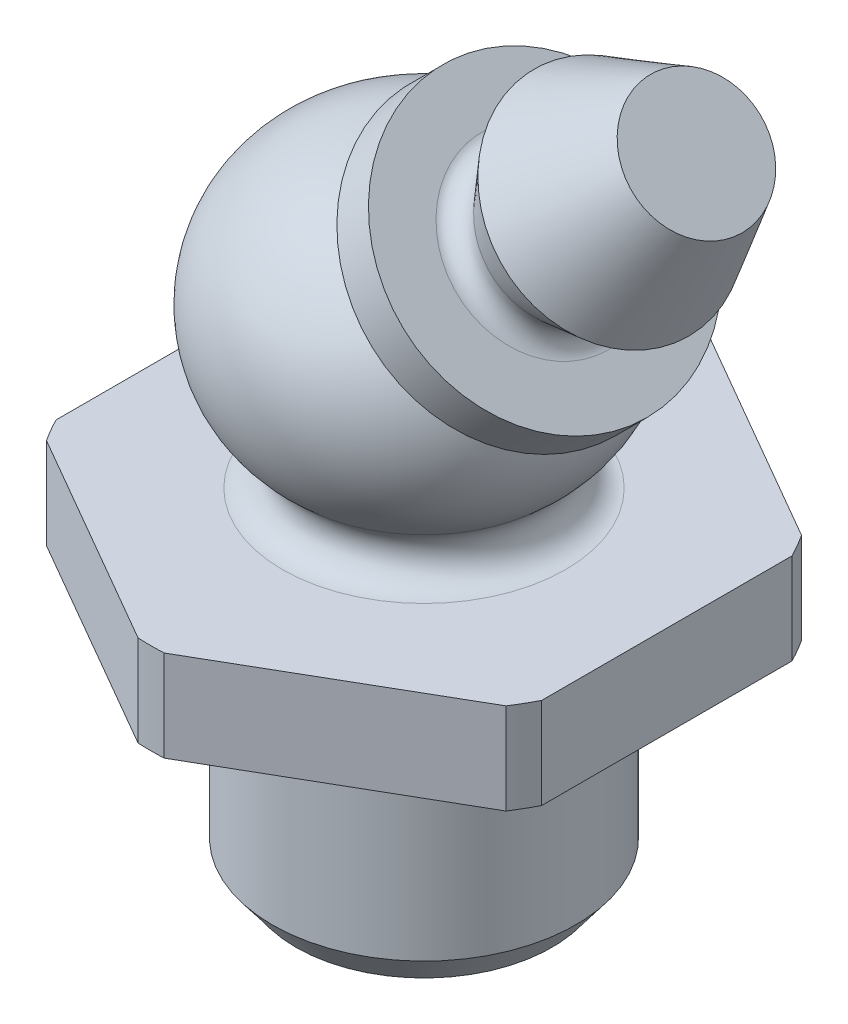
ISO-10303-21;
HEADER;
FILE_DESCRIPTION(('STEP AP214'),'2;1');
FILE_NAME('part.step','',(''),(''),'','','');
FILE_SCHEMA(('AUTOMOTIVE_DESIGN { 1 0 10303 214 1 1 1 1 }'));
ENDSEC;
DATA;
#1=APPLICATION_CONTEXT('core data for automotive mechanical design processes');
#2=APPLICATION_PROTOCOL_DEFINITION('international standard','automotive_design',2000,#1);
#3=PRODUCT_CONTEXT('',#1,'mechanical');
#4=PRODUCT('Part','Part','',(#3));
#5=PRODUCT_RELATED_PRODUCT_CATEGORY('part','',(#4));
#6=PRODUCT_DEFINITION_FORMATION('','',#4);
#7=PRODUCT_DEFINITION_CONTEXT('part definition',#1,'design');
#8=PRODUCT_DEFINITION('design','',#6,#7);
#9=PRODUCT_DEFINITION_SHAPE('','',#8);
#10=(LENGTH_UNIT() NAMED_UNIT(*) SI_UNIT(.MILLI.,.METRE.));
#11=(NAMED_UNIT(*) PLANE_ANGLE_UNIT() SI_UNIT($,.RADIAN.));
#12=(NAMED_UNIT(*) SI_UNIT($,.STERADIAN.) SOLID_ANGLE_UNIT());
#13=UNCERTAINTY_MEASURE_WITH_UNIT(LENGTH_MEASURE(1.E-05),#10,'distance_accuracy_value','');
#14=(GEOMETRIC_REPRESENTATION_CONTEXT(3) GLOBAL_UNCERTAINTY_ASSIGNED_CONTEXT((#13)) GLOBAL_UNIT_ASSIGNED_CONTEXT((#10,
#11,#12)) REPRESENTATION_CONTEXT('',''));
#15=CARTESIAN_POINT('',(0.,0.,0.));
#16=DIRECTION('',(0.,0.,1.));
#17=DIRECTION('',(1.,0.,0.));
#18=AXIS2_PLACEMENT_3D('',#15,#16,#17);
#19=CARTESIAN_POINT('',(124.18954153735,115.839668337099,0.));
#20=DIRECTION('',(0.,1.,0.));
#21=DIRECTION('',(0.,0.,1.));
#22=AXIS2_PLACEMENT_3D('',#19,#20,#21);
#23=DEGENERATE_TOROIDAL_SURFACE('',#22,1.05448971244709,4.77259244582958,.T.);
#24=CARTESIAN_POINT('',(124.18954153735,112.166094601161,0.));
#25=DIRECTION('',(0.,1.,0.));
#26=DIRECTION('',(0.,0.,1.));
#27=AXIS2_PLACEMENT_3D('',#24,#25,#26);
#28=CIRCLE('',#27,4.10120838351122);
#29=CARTESIAN_POINT('',(124.18954153735,112.166094601161,4.10120838351122));
#30=VERTEX_POINT('',#29);
#31=EDGE_CURVE('E138',#30,#30,#28,.T.);
#32=ORIENTED_EDGE('',*,*,#31,.T.);
#33=EDGE_LOOP('',(#32));
#34=FACE_BOUND('',#33,.T.);
#35=CARTESIAN_POINT('',(124.18954153735,120.605813119129,0.));
#36=DIRECTION('',(0.,1.,0.));
#37=DIRECTION('',(0.,0.,1.));
#38=AXIS2_PLACEMENT_3D('',#35,#36,#37);
#39=CIRCLE('',#38,0.806492594069938);
#40=CARTESIAN_POINT('',(124.18954153735,120.605813119129,0.806492594069938));
#41=VERTEX_POINT('',#40);
#42=EDGE_CURVE('E179',#41,#41,#39,.T.);
#43=ORIENTED_EDGE('',*,*,#42,.F.);
#44=EDGE_LOOP('',(#43));
#45=FACE_BOUND('',#44,.T.);
#46=CARTESIAN_POINT('',(125.131036083773,120.610922967324,0.));
#47=CARTESIAN_POINT('',(125.131040860136,120.610918190962,0.0784647715303782));
#48=CARTESIAN_POINT('',(125.130778353138,120.61118069796,0.156929956943864));
#49=CARTESIAN_POINT('',(125.130117366747,120.611841684351,0.313867685390066));
#50=CARTESIAN_POINT('',(125.129718870088,120.61224018101,0.392340228091622));
#51=CARTESIAN_POINT('',(125.129679585133,120.612279465964,0.549318766580502));
#52=CARTESIAN_POINT('',(125.130039044739,120.611920006359,0.62782476491391));
#53=CARTESIAN_POINT('',(125.13251168885,120.609447362248,0.784795329163086));
#54=CARTESIAN_POINT('',(125.134624950141,120.607334100957,0.863259893114233));
#55=CARTESIAN_POINT('',(125.142549866612,120.599409184486,1.04516080886588));
#56=CARTESIAN_POINT('',(125.149331311366,120.592627739732,1.14852415482292));
#57=CARTESIAN_POINT('',(125.168767406948,120.57319164415,1.35417410684675));
#58=CARTESIAN_POINT('',(125.181421667435,120.560537383663,1.45646078401294));
#59=CARTESIAN_POINT('',(125.21329309527,120.528665955828,1.65886602402139));
#60=CARTESIAN_POINT('',(125.232502320694,120.509456730404,1.75898705536138));
#61=CARTESIAN_POINT('',(125.277764068958,120.46419498214,1.95610971403431));
#62=CARTESIAN_POINT('',(125.303816926745,120.438142124353,2.05311118842594));
#63=CARTESIAN_POINT('',(125.361748866132,120.380210184966,2.23972135732183));
#64=CARTESIAN_POINT('',(125.393404381722,120.348554669376,2.32946874842445));
#65=CARTESIAN_POINT('',(125.462876302865,120.279082748233,2.50412013917399));
#66=CARTESIAN_POINT('',(125.500695657612,120.241263393485,2.58902179390939));
#67=CARTESIAN_POINT('',(125.582168545813,120.159790505285,2.75313269073555));
#68=CARTESIAN_POINT('',(125.625826468885,120.116132582213,2.83233758023833));
#69=CARTESIAN_POINT('',(125.718502209617,120.02345684148,2.98422044379819));
#70=CARTESIAN_POINT('',(125.76752200889,119.974437042208,3.05689598658013));
#71=CARTESIAN_POINT('',(125.906168400862,119.835790650236,3.24300446500373));
#72=CARTESIAN_POINT('',(126.000375240611,119.741583810487,3.34973923269063));
#73=CARTESIAN_POINT('',(126.19976723921,119.542191811888,3.53970115215595));
#74=CARTESIAN_POINT('',(126.304942826106,119.437016224992,3.62294856909045));
#75=CARTESIAN_POINT('',(126.52572399347,119.216235057628,3.76595819801677));
#76=CARTESIAN_POINT('',(126.641504441403,119.100454609695,3.82518046951592));
#77=CARTESIAN_POINT('',(126.878290302601,118.863668748497,3.91661116776653));
#78=CARTESIAN_POINT('',(126.999297696216,118.742661354882,3.94880925969924));
#79=CARTESIAN_POINT('',(127.248893225563,118.493065825535,3.98688059721811));
#80=CARTESIAN_POINT('',(127.377576857094,118.364382194004,3.99149878060146));
#81=CARTESIAN_POINT('',(127.633805629205,118.108153421893,3.97173487967213));
#82=CARTESIAN_POINT('',(127.761350565389,117.980608485709,3.94734769031208));
#83=CARTESIAN_POINT('',(128.018919979478,117.72303907162,3.86890499602616));
#84=CARTESIAN_POINT('',(128.148713882095,117.593245169003,3.81333649291587));
#85=CARTESIAN_POINT('',(128.400429063001,117.341529988096,3.67384273794982));
#86=CARTESIAN_POINT('',(128.5223483882,117.219610662898,3.58991048310191));
#87=CARTESIAN_POINT('',(128.762311211269,116.979647839829,3.39092227460121));
#88=CARTESIAN_POINT('',(128.879726517569,116.862232533529,3.27435153054034));
#89=CARTESIAN_POINT('',(129.100034997362,116.641924053736,3.01643197980449));
#90=CARTESIAN_POINT('',(129.202924439279,116.539034611818,2.87507682704957));
#91=CARTESIAN_POINT('',(129.397650401081,116.344308650017,2.56271599998821));
#92=CARTESIAN_POINT('',(129.488480221187,116.253478829911,2.39045500940214));
#93=CARTESIAN_POINT('',(129.649635215867,116.092323835231,2.02772699522131));
#94=CARTESIAN_POINT('',(129.71995504575,116.022004005348,1.83725524323006));
#95=CARTESIAN_POINT('',(129.841994239345,115.899964811752,1.43250070241409));
#96=CARTESIAN_POINT('',(129.892503486182,115.849455564916,1.21748745429929));
#97=CARTESIAN_POINT('',(129.968335578271,115.773623472827,0.778749287248784));
#98=CARTESIAN_POINT('',(129.99365270226,115.748306348837,0.555022401382772));
#99=CARTESIAN_POINT('',(130.01911987388,115.722839177218,0.0961045299503025));
#100=CARTESIAN_POINT('',(130.01827293121,115.723686119887,-0.139198189898909));
#101=CARTESIAN_POINT('',(129.988946451572,115.753012599526,-0.606359465192944));
#102=CARTESIAN_POINT('',(129.960463837302,115.781495213796,-0.838217634159115));
#103=CARTESIAN_POINT('',(129.876015383806,115.865943667292,-1.29400693840992));
#104=CARTESIAN_POINT('',(129.819800765812,115.922158285286,-1.51784626863055));
#105=CARTESIAN_POINT('',(129.680934397915,116.061024653183,-1.94851704921867));
#106=CARTESIAN_POINT('',(129.598284826015,116.143674225083,-2.15534989900392));
#107=CARTESIAN_POINT('',(129.410840112724,116.331118938374,-2.54028564094338));
#108=CARTESIAN_POINT('',(129.306652348022,116.435306703076,-2.71897896637511));
#109=CARTESIAN_POINT('',(129.077521633947,116.664437417151,-3.04746499230322));
#110=CARTESIAN_POINT('',(128.952584079428,116.789374971669,-3.1972651830657));
#111=CARTESIAN_POINT('',(128.692199780904,117.049759270194,-3.455370108626));
#112=CARTESIAN_POINT('',(128.557604029244,117.184355021854,-3.5653902226619));
#113=CARTESIAN_POINT('',(128.276622747587,117.465336303511,-3.74952875394297));
#114=CARTESIAN_POINT('',(128.130241405374,117.611717645724,-3.82365985856835));
#115=CARTESIAN_POINT('',(127.839518642183,117.902440408915,-3.9289787226573));
#116=CARTESIAN_POINT('',(127.695604741841,118.046354309257,-3.96252568457228));
#117=CARTESIAN_POINT('',(127.405835106239,118.336123944859,-3.99256348051926));
#118=CARTESIAN_POINT('',(127.259980078752,118.481978972345,-3.98906747039858));
#119=CARTESIAN_POINT('',(126.980169570469,118.761789480629,-3.94540682463853));
#120=CARTESIAN_POINT('',(126.846036010798,118.8959230403,-3.90752322109891));
#121=CARTESIAN_POINT('',(126.584695635834,119.157263415264,-3.79850632799147));
#122=CARTESIAN_POINT('',(126.457486131339,119.284472919759,-3.72738605143506));
#123=CARTESIAN_POINT('',(126.221353431621,119.520605619477,-3.55837922816593));
#124=CARTESIAN_POINT('',(126.111801245353,119.630157805745,-3.46224919919507));
#125=CARTESIAN_POINT('',(125.906406826799,119.835552224299,-3.2441233842014));
#126=CARTESIAN_POINT('',(125.810561715637,119.93139733546,-3.12213304298029));
#127=CARTESIAN_POINT('',(125.63998955643,120.101969494668,-2.86208589152341));
#128=CARTESIAN_POINT('',(125.564484772694,120.177474278404,-2.72504667453307));
#129=CARTESIAN_POINT('',(125.431277248973,120.310681802125,-2.43465925877062));
#130=CARTESIAN_POINT('',(125.373563401962,120.368395649136,-2.28132131617666));
#131=CARTESIAN_POINT('',(125.30179778071,120.440161270388,-2.04439892906727));
#132=CARTESIAN_POINT('',(125.280477090189,120.461481960909,-1.96505130143715));
#133=CARTESIAN_POINT('',(125.242413282681,120.499545768417,-1.80419474990905));
#134=CARTESIAN_POINT('',(125.2256689564,120.516290094697,-1.72268640323325));
#135=CARTESIAN_POINT('',(125.196653467346,120.545305583752,-1.5581298446548));
#136=CARTESIAN_POINT('',(125.184381261648,120.557577789449,-1.47508199652577));
#137=CARTESIAN_POINT('',(125.16400639096,120.577952660138,-1.30798850075459));
#138=CARTESIAN_POINT('',(125.155903502161,120.586055548937,-1.22394290691928));
#139=CARTESIAN_POINT('',(125.142586512531,120.599372538566,-1.04516301104944));
#140=CARTESIAN_POINT('',(125.137838430429,120.604120620669,-0.950361604153774));
#141=CARTESIAN_POINT('',(125.131739792575,120.610219258523,-0.760542883826378));
#142=CARTESIAN_POINT('',(125.1303904853,120.611568565798,-0.665525503885005));
#143=CARTESIAN_POINT('',(125.129437739407,120.612521311691,-0.475411862616107));
#144=CARTESIAN_POINT('',(125.129835819065,120.612123232033,-0.380315604498928));
#145=CARTESIAN_POINT('',(125.130632097584,120.611326953514,-0.190146433521275));
#146=CARTESIAN_POINT('',(125.131030296392,120.610928754706,-0.0950735205813859));
#147=CARTESIAN_POINT('',(125.131036083773,120.610922967324,0.));
#148=B_SPLINE_CURVE_WITH_KNOTS('',3,(#46,#47,#48,#49,#50,#51,#52,#53,#54,#55,#56,#57,#58,#59,
#60,#61,#62,#63,#64,#65,#66,#67,#68,#69,#70,#71,#72,#73,#74,#75,#76,#77,#78,#79,#80,#81,#82,#83,
#84,#85,#86,#87,#88,#89,#90,#91,#92,#93,#94,#95,#96,#97,#98,#99,#100,#101,#102,#103,#104,#105,
#106,#107,#108,#109,#110,#111,#112,#113,#114,#115,#116,#117,#118,#119,#120,#121,#122,#123,#124,
#125,#126,#127,#128,#129,#130,#131,#132,#133,#134,#135,#136,#137,#138,#139,#140,#141,#142,#143,
#144,#145,#146,#147),.UNSPECIFIED.,.T.,.F.,(4,2,2,2,2,2,2,2,2,2,2,2,2,2,2,2,2,2,2,2,2,2,2,2,2,2,
2,2,2,2,2,2,2,2,2,2,2,2,2,2,2,2,2,2,2,2,2,2,2,2,4),(0.,0.235395308470187,0.470820512377201,
0.706322727765188,0.941835254602455,1.25298328220711,1.56411063214073,1.87486235419642,
2.18562928820162,2.48602044246061,2.78655574826658,3.08731828972588,3.38819236328893,
3.89777611625557,4.40691884046708,4.9269427823187,5.44716550569206,5.99089156884238,
6.53471334385057,7.10754007252189,7.68050833520237,8.28649379037101,8.89263463610032,
9.53444414896598,10.1764207616149,10.8530797726238,11.5298924213979,12.2325259528632,
12.9352377333167,13.6443712965018,14.3534464484637,15.0447385701874,15.735851239522,
16.3920132449177,17.0479431161016,17.6635610453848,18.2789603446961,18.8563021088608,
19.4334180180267,19.977642117261,20.5217517455471,21.0404268570823,21.5587774966282,
21.8132012395445,22.0675576864396,22.3218547780067,22.5761382174759,22.8610766653632,
23.1461197648289,23.4314105827772,23.7166323487762),.UNSPECIFIED.);
#149=CARTESIAN_POINT('',(125.131036083773,120.610922967324,0.));
#150=VERTEX_POINT('',#149);
#151=EDGE_CURVE('E12',#150,#150,#148,.T.);
#152=ORIENTED_EDGE('',*,*,#151,.F.);
#153=EDGE_LOOP('',(#152));
#154=FACE_BOUND('',#153,.T.);
#155=ADVANCED_FACE('F39',(#34,#45,#154),#23,.T.);
#156=CARTESIAN_POINT('',(124.744428615574,107.605813119129,0.));
#157=DIRECTION('',(0.,1.,0.));
#158=DIRECTION('',(0.,0.,1.));
#159=AXIS2_PLACEMENT_3D('',#156,#157,#158);
#160=PLANE('',#159);
#161=CARTESIAN_POINT('',(124.18954153735,107.605813119129,0.));
#162=DIRECTION('',(0.,1.,0.));
#163=DIRECTION('',(0.,0.,1.));
#164=AXIS2_PLACEMENT_3D('',#161,#162,#163);
#165=CIRCLE('',#164,5.);
#166=CARTESIAN_POINT('',(124.18954153735,107.605813119129,5.));
#167=VERTEX_POINT('',#166);
#168=EDGE_CURVE('E170',#167,#167,#165,.T.);
#169=ORIENTED_EDGE('',*,*,#168,.T.);
#170=EDGE_LOOP('',(#169));
#171=FACE_BOUND('',#170,.T.);
#172=DIRECTION('',(-0.86602540378444,0.,0.499999999999998));
#173=VECTOR('',#172,1.);
#174=CARTESIAN_POINT('',(120.605706846018,107.605813119129,-7.1684763832626));
#175=LINE('',#174,#173);
#176=CARTESIAN_POINT('',(123.760255751621,107.605813119129,-8.98975604308438));
#177=VERTEX_POINT('',#176);
#178=CARTESIAN_POINT('',(116.618827323078,107.605813119129,-4.86665041746668));
#179=VERTEX_POINT('',#178);
#180=EDGE_CURVE('E203',#177,#179,#175,.T.);
#181=ORIENTED_EDGE('',*,*,#180,.F.);
#182=CARTESIAN_POINT('',(124.18954153735,107.605813119129,0.));
#183=DIRECTION('',(0.,1.,0.));
#184=DIRECTION('',(0.,0.,1.));
#185=AXIS2_PLACEMENT_3D('',#182,#183,#184);
#186=CIRCLE('',#185,9.00000000000004);
#187=CARTESIAN_POINT('',(124.618827323078,107.605813119129,-8.98975604308438));
#188=VERTEX_POINT('',#187);
#189=EDGE_CURVE('E202',#188,#177,#186,.T.);
#190=ORIENTED_EDGE('',*,*,#189,.F.);
#191=DIRECTION('',(-0.86602540378444,0.,-0.499999999999998));
#192=VECTOR('',#191,1.);
#193=CARTESIAN_POINT('',(128.605706846018,107.605813119129,-6.68793007728846));
#194=LINE('',#193,#192);
#195=CARTESIAN_POINT('',(131.760255751621,107.605813119129,-4.86665041746667));
#196=VERTEX_POINT('',#195);
#197=EDGE_CURVE('E221',#196,#188,#194,.T.);
#198=ORIENTED_EDGE('',*,*,#197,.F.);
#199=CARTESIAN_POINT('',(132.18954153735,107.605813119129,-4.12310562561772));
#200=VERTEX_POINT('',#199);
#201=EDGE_CURVE('E220',#200,#196,#186,.T.);
#202=ORIENTED_EDGE('',*,*,#201,.F.);
#203=DIRECTION('',(0.,0.,-1.));
#204=VECTOR('',#203,1.);
#205=CARTESIAN_POINT('',(132.18954153735,107.605813119129,0.));
#206=LINE('',#205,#204);
#207=CARTESIAN_POINT('',(132.18954153735,107.605813119129,4.12310562561772));
#208=VERTEX_POINT('',#207);
#209=EDGE_CURVE('E225',#208,#200,#206,.T.);
#210=ORIENTED_EDGE('',*,*,#209,.F.);
#211=CARTESIAN_POINT('',(131.760255751621,107.605813119129,4.86665041746668));
#212=VERTEX_POINT('',#211);
#213=EDGE_CURVE('E169',#212,#208,#186,.T.);
#214=ORIENTED_EDGE('',*,*,#213,.F.);
#215=DIRECTION('',(0.86602540378444,0.,-0.499999999999998));
#216=VECTOR('',#215,1.);
#217=CARTESIAN_POINT('',(128.605706846018,107.605813119129,6.68793007728846));
#218=LINE('',#217,#216);
#219=CARTESIAN_POINT('',(124.618827323078,107.605813119129,8.98975604308438));
#220=VERTEX_POINT('',#219);
#221=EDGE_CURVE('E314',#220,#212,#218,.T.);
#222=ORIENTED_EDGE('',*,*,#221,.F.);
#223=CARTESIAN_POINT('',(123.760255751621,107.605813119129,8.98975604308438));
#224=VERTEX_POINT('',#223);
#225=EDGE_CURVE('E165',#224,#220,#186,.T.);
#226=ORIENTED_EDGE('',*,*,#225,.F.);
#227=DIRECTION('',(0.86602540378444,0.,0.499999999999998));
#228=VECTOR('',#227,1.);
#229=CARTESIAN_POINT('',(120.605706846018,107.605813119129,7.1684763832626));
#230=LINE('',#229,#228);
#231=CARTESIAN_POINT('',(116.618827323078,107.605813119129,4.86665041746668));
#232=VERTEX_POINT('',#231);
#233=EDGE_CURVE('E305',#232,#224,#230,.T.);
#234=ORIENTED_EDGE('',*,*,#233,.F.);
#235=CARTESIAN_POINT('',(116.18954153735,107.605813119129,4.12310562561772));
#236=VERTEX_POINT('',#235);
#237=EDGE_CURVE('E168',#236,#232,#186,.T.);
#238=ORIENTED_EDGE('',*,*,#237,.F.);
#239=DIRECTION('',(0.,0.,1.));
#240=VECTOR('',#239,1.);
#241=CARTESIAN_POINT('',(116.18954153735,107.605813119129,0.));
#242=LINE('',#241,#240);
#243=CARTESIAN_POINT('',(116.18954153735,107.605813119129,-4.12310562561772));
#244=VERTEX_POINT('',#243);
#245=EDGE_CURVE('E148',#244,#236,#242,.T.);
#246=ORIENTED_EDGE('',*,*,#245,.F.);
#247=EDGE_CURVE('E147',#179,#244,#186,.T.);
#248=ORIENTED_EDGE('',*,*,#247,.F.);
#249=EDGE_LOOP('',(#181,#190,#198,#202,#210,#214,#222,#226,#234,#238,#246,#248));
#250=FACE_BOUND('',#249,.T.);
#251=ADVANCED_FACE('F248',(#171,#250),#160,.F.);
#252=CARTESIAN_POINT('',(124.18954153735,120.605813119129,0.));
#253=DIRECTION('',(0.,1.,0.));
#254=DIRECTION('',(0.,0.,1.));
#255=AXIS2_PLACEMENT_3D('',#252,#253,#254);
#256=CYLINDRICAL_SURFACE('',#255,9.00000000000004);
#257=CARTESIAN_POINT('',(124.18954153735,110.605813119129,0.));
#258=DIRECTION('',(0.,1.,0.));
#259=DIRECTION('',(0.,0.,1.));
#260=AXIS2_PLACEMENT_3D('',#257,#258,#259);
#261=CIRCLE('',#260,9.00000000000004);
#262=CARTESIAN_POINT('',(116.618827323078,110.605813119129,-4.86665041746668));
#263=VERTEX_POINT('',#262);
#264=CARTESIAN_POINT('',(116.18954153735,110.605813119129,-4.12310562561772));
#265=VERTEX_POINT('',#264);
#266=EDGE_CURVE('E145',#263,#265,#261,.T.);
#267=ORIENTED_EDGE('',*,*,#266,.F.);
#268=DIRECTION('',(0.,1.,0.));
#269=VECTOR('',#268,1.);
#270=CARTESIAN_POINT('',(116.618827323078,120.605813119129,-4.86665041746668));
#271=LINE('',#270,#269);
#272=EDGE_CURVE('E195',#263,#179,#271,.F.);
#273=ORIENTED_EDGE('',*,*,#272,.T.);
#274=ORIENTED_EDGE('',*,*,#247,.T.);
#275=DIRECTION('',(0.,1.,0.));
#276=VECTOR('',#275,1.);
#277=CARTESIAN_POINT('',(116.18954153735,120.605813119129,-4.12310562561772));
#278=LINE('',#277,#276);
#279=EDGE_CURVE('E131',#244,#265,#278,.T.);
#280=ORIENTED_EDGE('',*,*,#279,.T.);
#281=EDGE_LOOP('',(#267,#273,#274,#280));
#282=FACE_BOUND('',#281,.T.);
#283=ADVANCED_FACE('F143',(#282),#256,.T.);
#284=ORIENTED_EDGE('',*,*,#189,.T.);
#285=DIRECTION('',(0.,1.,0.));
#286=VECTOR('',#285,1.);
#287=CARTESIAN_POINT('',(123.760255751621,120.605813119129,-8.98975604308438));
#288=LINE('',#287,#286);
#289=CARTESIAN_POINT('',(123.760255751621,110.605813119129,-8.98975604308437));
#290=VERTEX_POINT('',#289);
#291=EDGE_CURVE('E193',#177,#290,#288,.T.);
#292=ORIENTED_EDGE('',*,*,#291,.T.);
#293=CARTESIAN_POINT('',(124.618827323078,110.605813119129,-8.98975604308438));
#294=VERTEX_POINT('',#293);
#295=EDGE_CURVE('E154',#294,#290,#261,.T.);
#296=ORIENTED_EDGE('',*,*,#295,.F.);
#297=DIRECTION('',(0.,1.,0.));
#298=VECTOR('',#297,1.);
#299=CARTESIAN_POINT('',(124.618827323078,120.605813119129,-8.98975604308438));
#300=LINE('',#299,#298);
#301=EDGE_CURVE('E204',#294,#188,#300,.F.);
#302=ORIENTED_EDGE('',*,*,#301,.T.);
#303=EDGE_LOOP('',(#284,#292,#296,#302));
#304=FACE_BOUND('',#303,.T.);
#305=ADVANCED_FACE('F199',(#304),#256,.T.);
#306=ORIENTED_EDGE('',*,*,#201,.T.);
#307=DIRECTION('',(0.,1.,0.));
#308=VECTOR('',#307,1.);
#309=CARTESIAN_POINT('',(131.760255751621,120.605813119129,-4.86665041746667));
#310=LINE('',#309,#308);
#311=CARTESIAN_POINT('',(131.760255751621,110.605813119129,-4.86665041746668));
#312=VERTEX_POINT('',#311);
#313=EDGE_CURVE('E213',#196,#312,#310,.T.);
#314=ORIENTED_EDGE('',*,*,#313,.T.);
#315=CARTESIAN_POINT('',(132.18954153735,110.605813119129,-4.12310562561772));
#316=VERTEX_POINT('',#315);
#317=EDGE_CURVE('E157',#316,#312,#261,.T.);
#318=ORIENTED_EDGE('',*,*,#317,.F.);
#319=DIRECTION('',(0.,1.,0.));
#320=VECTOR('',#319,1.);
#321=CARTESIAN_POINT('',(132.18954153735,120.605813119129,-4.12310562561772));
#322=LINE('',#321,#320);
#323=EDGE_CURVE('E222',#316,#200,#322,.F.);
#324=ORIENTED_EDGE('',*,*,#323,.T.);
#325=EDGE_LOOP('',(#306,#314,#318,#324));
#326=FACE_BOUND('',#325,.T.);
#327=ADVANCED_FACE('F217',(#326),#256,.T.);
#328=ORIENTED_EDGE('',*,*,#213,.T.);
#329=DIRECTION('',(0.,1.,0.));
#330=VECTOR('',#329,1.);
#331=CARTESIAN_POINT('',(132.18954153735,120.605813119129,4.12310562561772));
#332=LINE('',#331,#330);
#333=CARTESIAN_POINT('',(132.18954153735,110.605813119129,4.12310562561772));
#334=VERTEX_POINT('',#333);
#335=EDGE_CURVE('E293',#208,#334,#332,.T.);
#336=ORIENTED_EDGE('',*,*,#335,.T.);
#337=CARTESIAN_POINT('',(131.760255751621,110.605813119129,4.86665041746668));
#338=VERTEX_POINT('',#337);
#339=EDGE_CURVE('E163',#338,#334,#261,.T.);
#340=ORIENTED_EDGE('',*,*,#339,.F.);
#341=DIRECTION('',(0.,1.,0.));
#342=VECTOR('',#341,1.);
#343=CARTESIAN_POINT('',(131.760255751621,120.605813119129,4.86665041746667));
#344=LINE('',#343,#342);
#345=EDGE_CURVE('E295',#338,#212,#344,.F.);
#346=ORIENTED_EDGE('',*,*,#345,.T.);
#347=EDGE_LOOP('',(#328,#336,#340,#346));
#348=FACE_BOUND('',#347,.T.);
#349=ADVANCED_FACE('F279',(#348),#256,.T.);
#350=ORIENTED_EDGE('',*,*,#225,.T.);
#351=DIRECTION('',(0.,1.,0.));
#352=VECTOR('',#351,1.);
#353=CARTESIAN_POINT('',(124.618827323078,120.605813119129,8.98975604308438));
#354=LINE('',#353,#352);
#355=CARTESIAN_POINT('',(124.618827323078,110.605813119129,8.98975604308438));
#356=VERTEX_POINT('',#355);
#357=EDGE_CURVE('E307',#220,#356,#354,.T.);
#358=ORIENTED_EDGE('',*,*,#357,.T.);
#359=CARTESIAN_POINT('',(123.760255751621,110.605813119129,8.98975604308438));
#360=VERTEX_POINT('',#359);
#361=EDGE_CURVE('E158',#360,#356,#261,.T.);
#362=ORIENTED_EDGE('',*,*,#361,.F.);
#363=DIRECTION('',(0.,1.,0.));
#364=VECTOR('',#363,1.);
#365=CARTESIAN_POINT('',(123.760255751621,120.605813119129,8.98975604308438));
#366=LINE('',#365,#364);
#367=EDGE_CURVE('E57',#360,#224,#366,.F.);
#368=ORIENTED_EDGE('',*,*,#367,.T.);
#369=EDGE_LOOP('',(#350,#358,#362,#368));
#370=FACE_BOUND('',#369,.T.);
#371=ADVANCED_FACE('F243',(#370),#256,.T.);
#372=ORIENTED_EDGE('',*,*,#237,.T.);
#373=DIRECTION('',(0.,1.,0.));
#374=VECTOR('',#373,1.);
#375=CARTESIAN_POINT('',(116.618827323078,120.605813119129,4.86665041746668));
#376=LINE('',#375,#374);
#377=CARTESIAN_POINT('',(116.618827323078,110.605813119129,4.86665041746668));
#378=VERTEX_POINT('',#377);
#379=EDGE_CURVE('E302',#232,#378,#376,.T.);
#380=ORIENTED_EDGE('',*,*,#379,.T.);
#381=CARTESIAN_POINT('',(116.18954153735,110.605813119129,4.12310562561772));
#382=VERTEX_POINT('',#381);
#383=EDGE_CURVE('E155',#382,#378,#261,.T.);
#384=ORIENTED_EDGE('',*,*,#383,.F.);
#385=DIRECTION('',(0.,1.,0.));
#386=VECTOR('',#385,1.);
#387=CARTESIAN_POINT('',(116.18954153735,120.605813119129,4.12310562561772));
#388=LINE('',#387,#386);
#389=EDGE_CURVE('E65',#382,#236,#388,.F.);
#390=ORIENTED_EDGE('',*,*,#389,.T.);
#391=EDGE_LOOP('',(#372,#380,#384,#390));
#392=FACE_BOUND('',#391,.T.);
#393=ADVANCED_FACE('F236',(#392),#256,.T.);
#394=CARTESIAN_POINT('',(124.744428615574,110.605813119129,0.));
#395=DIRECTION('',(0.,-1.,0.));
#396=DIRECTION('',(0.,0.,-1.));
#397=AXIS2_PLACEMENT_3D('',#394,#395,#396);
#398=PLANE('',#397);
#399=CARTESIAN_POINT('',(124.18954153735,110.605813119129,0.));
#400=DIRECTION('',(0.,1.,0.));
#401=DIRECTION('',(0.,0.,1.));
#402=AXIS2_PLACEMENT_3D('',#399,#400,#401);
#403=CIRCLE('',#402,4.66403637210605);
#404=CARTESIAN_POINT('',(124.18954153735,110.605813119129,4.66403637210605));
#405=VERTEX_POINT('',#404);
#406=EDGE_CURVE('E162',#405,#405,#403,.T.);
#407=ORIENTED_EDGE('',*,*,#406,.F.);
#408=EDGE_LOOP('',(#407));
#409=FACE_BOUND('',#408,.T.);
#410=DIRECTION('',(0.86602540378444,0.,-0.499999999999998));
#411=VECTOR('',#410,1.);
#412=CARTESIAN_POINT('',(120.605706846018,110.605813119129,-7.1684763832626));
#413=LINE('',#412,#411);
#414=EDGE_CURVE('E50',#263,#290,#413,.T.);
#415=ORIENTED_EDGE('',*,*,#414,.F.);
#416=ORIENTED_EDGE('',*,*,#266,.T.);
#417=DIRECTION('',(0.,0.,-1.));
#418=VECTOR('',#417,1.);
#419=CARTESIAN_POINT('',(116.18954153735,110.605813119129,0.));
#420=LINE('',#419,#418);
#421=EDGE_CURVE('E128',#382,#265,#420,.T.);
#422=ORIENTED_EDGE('',*,*,#421,.F.);
#423=ORIENTED_EDGE('',*,*,#383,.T.);
#424=DIRECTION('',(-0.86602540378444,0.,-0.499999999999998));
#425=VECTOR('',#424,1.);
#426=CARTESIAN_POINT('',(120.605706846018,110.605813119129,7.1684763832626));
#427=LINE('',#426,#425);
#428=EDGE_CURVE('E137',#360,#378,#427,.T.);
#429=ORIENTED_EDGE('',*,*,#428,.F.);
#430=ORIENTED_EDGE('',*,*,#361,.T.);
#431=DIRECTION('',(-0.86602540378444,0.,0.499999999999998));
#432=VECTOR('',#431,1.);
#433=CARTESIAN_POINT('',(128.605706846018,110.605813119129,6.68793007728846));
#434=LINE('',#433,#432);
#435=EDGE_CURVE('E185',#338,#356,#434,.T.);
#436=ORIENTED_EDGE('',*,*,#435,.F.);
#437=ORIENTED_EDGE('',*,*,#339,.T.);
#438=DIRECTION('',(0.,0.,1.));
#439=VECTOR('',#438,1.);
#440=CARTESIAN_POINT('',(132.18954153735,110.605813119129,0.));
#441=LINE('',#440,#439);
#442=EDGE_CURVE('E187',#316,#334,#441,.T.);
#443=ORIENTED_EDGE('',*,*,#442,.F.);
#444=ORIENTED_EDGE('',*,*,#317,.T.);
#445=DIRECTION('',(0.86602540378444,0.,0.499999999999998));
#446=VECTOR('',#445,1.);
#447=CARTESIAN_POINT('',(128.605706846018,110.605813119129,-6.68793007728846));
#448=LINE('',#447,#446);
#449=EDGE_CURVE('E189',#294,#312,#448,.T.);
#450=ORIENTED_EDGE('',*,*,#449,.F.);
#451=ORIENTED_EDGE('',*,*,#295,.T.);
#452=EDGE_LOOP('',(#415,#416,#422,#423,#429,#430,#436,#437,#443,#444,#450,#451));
#453=FACE_BOUND('',#452,.T.);
#454=ADVANCED_FACE('F152',(#409,#453),#398,.F.);
#455=CARTESIAN_POINT('',(124.18954153735,111.487466102773,0.));
#456=DIRECTION('',(0.,1.,0.));
#457=DIRECTION('',(0.,0.,1.));
#458=AXIS2_PLACEMENT_3D('',#455,#456,#457);
#459=TOROIDAL_SURFACE('',#458,4.66403637210605,0.881652983644484);
#460=ORIENTED_EDGE('',*,*,#406,.T.);
#461=EDGE_LOOP('',(#460));
#462=FACE_BOUND('',#461,.T.);
#463=ORIENTED_EDGE('',*,*,#31,.F.);
#464=EDGE_LOOP('',(#463));
#465=FACE_BOUND('',#464,.T.);
#466=ADVANCED_FACE('F41',(#462,#465),#459,.F.);
#467=CARTESIAN_POINT('',(124.744428615574,120.605813119129,0.));
#468=DIRECTION('',(0.,-1.,0.));
#469=DIRECTION('',(0.,0.,-1.));
#470=AXIS2_PLACEMENT_3D('',#467,#468,#469);
#471=PLANE('',#470);
#472=ORIENTED_EDGE('',*,*,#42,.T.);
#473=EDGE_LOOP('',(#472));
#474=FACE_BOUND('',#473,.T.);
#475=ADVANCED_FACE('F242',(#474),#471,.F.);
#476=CARTESIAN_POINT('',(124.744428615574,99.6058131191287,0.));
#477=DIRECTION('',(0.,-1.,0.));
#478=DIRECTION('',(0.,0.,-1.));
#479=AXIS2_PLACEMENT_3D('',#476,#477,#478);
#480=PLANE('',#479);
#481=CARTESIAN_POINT('',(124.18954153735,99.6058131191287,0.));
#482=DIRECTION('',(0.,1.,0.));
#483=DIRECTION('',(0.,0.,1.));
#484=AXIS2_PLACEMENT_3D('',#481,#482,#483);
#485=CIRCLE('',#484,4.21904707612161);
#486=CARTESIAN_POINT('',(124.18954153735,99.6058131191287,4.21904707612161));
#487=VERTEX_POINT('',#486);
#488=EDGE_CURVE('E176',#487,#487,#485,.T.);
#489=ORIENTED_EDGE('',*,*,#488,.F.);
#490=EDGE_LOOP('',(#489));
#491=FACE_BOUND('',#490,.T.);
#492=ADVANCED_FACE('F260',(#491),#480,.T.);
#493=CARTESIAN_POINT('',(124.18954153735,99.6058131191287,0.));
#494=DIRECTION('',(0.,1.,0.));
#495=DIRECTION('',(0.,0.,1.));
#496=AXIS2_PLACEMENT_3D('',#493,#494,#495);
#497=CONICAL_SURFACE('',#496,4.21904707612161,0.647155317449029);
#498=CARTESIAN_POINT('',(124.18954153735,100.639194960427,0.));
#499=DIRECTION('',(0.,1.,0.));
#500=DIRECTION('',(0.,0.,1.));
#501=AXIS2_PLACEMENT_3D('',#498,#499,#500);
#502=CIRCLE('',#501,5.);
#503=CARTESIAN_POINT('',(124.18954153735,100.639194960427,5.));
#504=VERTEX_POINT('',#503);
#505=EDGE_CURVE('E173',#504,#504,#502,.T.);
#506=ORIENTED_EDGE('',*,*,#505,.F.);
#507=EDGE_LOOP('',(#506));
#508=FACE_BOUND('',#507,.T.);
#509=ORIENTED_EDGE('',*,*,#488,.T.);
#510=EDGE_LOOP('',(#509));
#511=FACE_BOUND('',#510,.T.);
#512=ADVANCED_FACE('F264',(#508,#511),#497,.T.);
#513=CARTESIAN_POINT('',(124.18954153735,120.605813119129,0.));
#514=DIRECTION('',(0.,1.,0.));
#515=DIRECTION('',(0.,0.,1.));
#516=AXIS2_PLACEMENT_3D('',#513,#514,#515);
#517=CYLINDRICAL_SURFACE('',#516,5.);
#518=ORIENTED_EDGE('',*,*,#505,.T.);
#519=EDGE_LOOP('',(#518));
#520=FACE_BOUND('',#519,.T.);
#521=ORIENTED_EDGE('',*,*,#168,.F.);
#522=EDGE_LOOP('',(#521));
#523=FACE_BOUND('',#522,.T.);
#524=ADVANCED_FACE('F268',(#520,#523),#517,.T.);
#525=CARTESIAN_POINT('',(116.18954153735,99.6058131191287,-4.61880215351703));
#526=DIRECTION('',(-1.,0.,0.));
#527=DIRECTION('',(0.,0.,1.));
#528=AXIS2_PLACEMENT_3D('',#525,#526,#527);
#529=PLANE('',#528);
#530=ORIENTED_EDGE('',*,*,#421,.T.);
#531=ORIENTED_EDGE('',*,*,#279,.F.);
#532=ORIENTED_EDGE('',*,*,#245,.T.);
#533=ORIENTED_EDGE('',*,*,#389,.F.);
#534=EDGE_LOOP('',(#530,#531,#532,#533));
#535=FACE_BOUND('',#534,.T.);
#536=ADVANCED_FACE('F130',(#535),#529,.T.);
#537=CARTESIAN_POINT('',(124.18954153735,99.6058131191287,9.23760430703401));
#538=DIRECTION('',(-0.499999999999998,0.,0.86602540378444));
#539=DIRECTION('',(0.86602540378444,0.,0.499999999999998));
#540=AXIS2_PLACEMENT_3D('',#537,#538,#539);
#541=PLANE('',#540);
#542=ORIENTED_EDGE('',*,*,#428,.T.);
#543=ORIENTED_EDGE('',*,*,#379,.F.);
#544=ORIENTED_EDGE('',*,*,#233,.T.);
#545=ORIENTED_EDGE('',*,*,#367,.F.);
#546=EDGE_LOOP('',(#542,#543,#544,#545));
#547=FACE_BOUND('',#546,.T.);
#548=ADVANCED_FACE('F324',(#547),#541,.T.);
#549=CARTESIAN_POINT('',(124.18954153735,99.6058131191287,9.23760430703401));
#550=DIRECTION('',(0.499999999999998,0.,0.86602540378444));
#551=DIRECTION('',(0.86602540378444,0.,-0.499999999999998));
#552=AXIS2_PLACEMENT_3D('',#549,#550,#551);
#553=PLANE('',#552);
#554=ORIENTED_EDGE('',*,*,#435,.T.);
#555=ORIENTED_EDGE('',*,*,#357,.F.);
#556=ORIENTED_EDGE('',*,*,#221,.T.);
#557=ORIENTED_EDGE('',*,*,#345,.F.);
#558=EDGE_LOOP('',(#554,#555,#556,#557));
#559=FACE_BOUND('',#558,.T.);
#560=ADVANCED_FACE('F322',(#559),#553,.T.);
#561=CARTESIAN_POINT('',(132.18954153735,99.6058131191287,-4.61880215351703));
#562=DIRECTION('',(1.,0.,0.));
#563=DIRECTION('',(0.,0.,-1.));
#564=AXIS2_PLACEMENT_3D('',#561,#562,#563);
#565=PLANE('',#564);
#566=ORIENTED_EDGE('',*,*,#442,.T.);
#567=ORIENTED_EDGE('',*,*,#335,.F.);
#568=ORIENTED_EDGE('',*,*,#209,.T.);
#569=ORIENTED_EDGE('',*,*,#323,.F.);
#570=EDGE_LOOP('',(#566,#567,#568,#569));
#571=FACE_BOUND('',#570,.T.);
#572=ADVANCED_FACE('F318',(#571),#565,.T.);
#573=CARTESIAN_POINT('',(124.18954153735,99.6058131191287,-9.23760430703401));
#574=DIRECTION('',(0.499999999999998,0.,-0.86602540378444));
#575=DIRECTION('',(-0.86602540378444,0.,-0.499999999999998));
#576=AXIS2_PLACEMENT_3D('',#573,#574,#575);
#577=PLANE('',#576);
#578=ORIENTED_EDGE('',*,*,#449,.T.);
#579=ORIENTED_EDGE('',*,*,#313,.F.);
#580=ORIENTED_EDGE('',*,*,#197,.T.);
#581=ORIENTED_EDGE('',*,*,#301,.F.);
#582=EDGE_LOOP('',(#578,#579,#580,#581));
#583=FACE_BOUND('',#582,.T.);
#584=ADVANCED_FACE('F212',(#583),#577,.T.);
#585=CARTESIAN_POINT('',(124.18954153735,99.6058131191287,-9.23760430703401));
#586=DIRECTION('',(-0.499999999999998,0.,-0.86602540378444));
#587=DIRECTION('',(-0.86602540378444,0.,0.499999999999998));
#588=AXIS2_PLACEMENT_3D('',#585,#586,#587);
#589=PLANE('',#588);
#590=ORIENTED_EDGE('',*,*,#414,.T.);
#591=ORIENTED_EDGE('',*,*,#291,.F.);
#592=ORIENTED_EDGE('',*,*,#180,.T.);
#593=ORIENTED_EDGE('',*,*,#272,.F.);
#594=EDGE_LOOP('',(#590,#591,#592,#593));
#595=FACE_BOUND('',#594,.T.);
#596=ADVANCED_FACE('F192',(#595),#589,.T.);
#597=CARTESIAN_POINT('',(123.778101502475,121.963857548623,0.));
#598=DIRECTION('',(0.707106781186546,0.707106781186549,0.));
#599=DIRECTION('',(-0.707106781186549,0.707106781186546,0.));
#600=AXIS2_PLACEMENT_3D('',#597,#598,#599);
#601=PLANE('',#600);
#602=CARTESIAN_POINT('',(127.137257466553,118.604701584545,0.));
#603=DIRECTION('',(-0.707106781186546,-0.707106781186549,0.));
#604=DIRECTION('',(0.707106781186549,-0.707106781186546,0.));
#605=AXIS2_PLACEMENT_3D('',#602,#603,#604);
#606=CIRCLE('',#605,4.75056392252546);
#607=CARTESIAN_POINT('',(130.496413430631,115.245545620467,0.));
#608=VERTEX_POINT('',#607);
#609=EDGE_CURVE('E374',#608,#608,#606,.T.);
#610=ORIENTED_EDGE('',*,*,#609,.T.);
#611=EDGE_LOOP('',(#610));
#612=FACE_BOUND('',#611,.T.);
#613=ORIENTED_EDGE('',*,*,#151,.T.);
#614=EDGE_LOOP('',(#613));
#615=FACE_BOUND('',#614,.T.);
#616=ADVANCED_FACE('F336',(#612,#615),#601,.F.);
#617=CARTESIAN_POINT('',(133.163968863917,124.631412981909,0.));
#618=DIRECTION('',(-0.707106781186546,-0.707106781186549,0.));
#619=DIRECTION('',(0.707106781186549,-0.707106781186546,0.));
#620=AXIS2_PLACEMENT_3D('',#617,#618,#619);
#621=PLANE('',#620);
#622=CARTESIAN_POINT('',(133.163968863917,124.631412981909,0.));
#623=DIRECTION('',(-0.707106781186546,-0.707106781186549,0.));
#624=DIRECTION('',(0.707106781186549,-0.707106781186546,0.));
#625=AXIS2_PLACEMENT_3D('',#622,#623,#624);
#626=CIRCLE('',#625,2.13249161559834);
#627=CARTESIAN_POINT('',(134.67186814613,123.123513699696,0.));
#628=VERTEX_POINT('',#627);
#629=EDGE_CURVE('E149',#628,#628,#626,.T.);
#630=ORIENTED_EDGE('',*,*,#629,.F.);
#631=EDGE_LOOP('',(#630));
#632=FACE_BOUND('',#631,.T.);
#633=ADVANCED_FACE('F341',(#632),#621,.F.);
#634=CARTESIAN_POINT('',(133.163968863917,124.631412981909,0.));
#635=DIRECTION('',(-0.707106781186546,-0.707106781186549,0.));
#636=DIRECTION('',(0.707106781186549,-0.707106781186546,0.));
#637=AXIS2_PLACEMENT_3D('',#634,#635,#636);
#638=CONICAL_SURFACE('',#637,2.13249161559833,0.354238820246436);
#639=CARTESIAN_POINT('',(130.367208259862,121.834652377854,0.));
#640=DIRECTION('',(-0.707106781186546,-0.707106781186549,0.));
#641=DIRECTION('',(0.707106781186549,-0.707106781186546,0.));
#642=AXIS2_PLACEMENT_3D('',#639,#640,#641);
#643=CIRCLE('',#642,3.59528737885499);
#644=CARTESIAN_POINT('',(132.909460345765,119.292400291951,0.));
#645=VERTEX_POINT('',#644);
#646=EDGE_CURVE('E387',#645,#645,#643,.T.);
#647=ORIENTED_EDGE('',*,*,#646,.F.);
#648=EDGE_LOOP('',(#647));
#649=FACE_BOUND('',#648,.T.);
#650=ORIENTED_EDGE('',*,*,#629,.T.);
#651=EDGE_LOOP('',(#650));
#652=FACE_BOUND('',#651,.T.);
#653=ADVANCED_FACE('F348',(#649,#652),#638,.T.);
#654=CARTESIAN_POINT('',(130.367208259862,121.834652377854,0.));
#655=DIRECTION('',(0.707106781186546,0.707106781186549,0.));
#656=DIRECTION('',(-0.707106781186549,0.707106781186546,0.));
#657=AXIS2_PLACEMENT_3D('',#654,#655,#656);
#658=CONICAL_SURFACE('',#657,3.59528737885499,0.484102180750787);
#659=CARTESIAN_POINT('',(128.782013652226,120.249457770217,0.));
#660=DIRECTION('',(-0.707106781186546,-0.707106781186549,0.));
#661=DIRECTION('',(0.707106781186549,-0.707106781186546,0.));
#662=AXIS2_PLACEMENT_3D('',#659,#660,#661);
#663=CIRCLE('',#662,2.41646616803478);
#664=CARTESIAN_POINT('',(130.490713266151,118.540758156292,0.));
#665=VERTEX_POINT('',#664);
#666=EDGE_CURVE('E381',#665,#665,#663,.T.);
#667=ORIENTED_EDGE('',*,*,#666,.F.);
#668=EDGE_LOOP('',(#667));
#669=FACE_BOUND('',#668,.T.);
#670=ORIENTED_EDGE('',*,*,#646,.T.);
#671=EDGE_LOOP('',(#670));
#672=FACE_BOUND('',#671,.T.);
#673=ADVANCED_FACE('F352',(#669,#672),#658,.T.);
#674=CARTESIAN_POINT('',(128.58979836526,120.057242483252,0.));
#675=DIRECTION('',(-0.707106781186546,-0.707106781186549,0.));
#676=DIRECTION('',(0.707106781186549,-0.707106781186546,0.));
#677=AXIS2_PLACEMENT_3D('',#674,#675,#676);
#678=TOROIDAL_SURFACE('',#677,2.93342095915306,0.584068223024017);
#679=CARTESIAN_POINT('',(128.176799764084,119.644243882076,0.));
#680=DIRECTION('',(-0.707106781186546,-0.707106781186549,0.));
#681=DIRECTION('',(0.707106781186549,-0.707106781186546,0.));
#682=AXIS2_PLACEMENT_3D('',#679,#680,#681);
#683=CIRCLE('',#682,2.93342095915305);
#684=CARTESIAN_POINT('',(130.251041616376,117.570002029784,0.));
#685=VERTEX_POINT('',#684);
#686=EDGE_CURVE('E378',#685,#685,#683,.T.);
#687=ORIENTED_EDGE('',*,*,#686,.F.);
#688=EDGE_LOOP('',(#687));
#689=FACE_BOUND('',#688,.T.);
#690=ORIENTED_EDGE('',*,*,#666,.T.);
#691=EDGE_LOOP('',(#690));
#692=FACE_BOUND('',#691,.T.);
#693=ADVANCED_FACE('F356',(#689,#692),#678,.F.);
#694=CARTESIAN_POINT('',(126.102557911793,121.718485734368,0.));
#695=DIRECTION('',(-0.707106781186546,-0.707106781186549,0.));
#696=DIRECTION('',(0.707106781186549,-0.707106781186546,0.));
#697=AXIS2_PLACEMENT_3D('',#694,#695,#696);
#698=PLANE('',#697);
#699=CARTESIAN_POINT('',(128.176799764084,119.644243882076,0.));
#700=DIRECTION('',(-0.707106781186546,-0.707106781186549,0.));
#701=DIRECTION('',(0.707106781186549,-0.707106781186546,0.));
#702=AXIS2_PLACEMENT_3D('',#699,#700,#701);
#703=CIRCLE('',#702,4.75056392252546);
#704=CARTESIAN_POINT('',(131.535955728162,116.285087917998,0.));
#705=VERTEX_POINT('',#704);
#706=EDGE_CURVE('E377',#705,#705,#703,.T.);
#707=ORIENTED_EDGE('',*,*,#706,.F.);
#708=EDGE_LOOP('',(#707));
#709=FACE_BOUND('',#708,.T.);
#710=ORIENTED_EDGE('',*,*,#686,.T.);
#711=EDGE_LOOP('',(#710));
#712=FACE_BOUND('',#711,.T.);
#713=ADVANCED_FACE('F360',(#709,#712),#698,.F.);
#714=CARTESIAN_POINT('',(124.555886728273,116.023330846265,0.));
#715=DIRECTION('',(-0.707106781186546,-0.707106781186549,0.));
#716=DIRECTION('',(0.707106781186549,-0.707106781186546,0.));
#717=AXIS2_PLACEMENT_3D('',#714,#715,#716);
#718=CYLINDRICAL_SURFACE('',#717,4.75056392252547);
#719=ORIENTED_EDGE('',*,*,#609,.F.);
#720=EDGE_LOOP('',(#719));
#721=FACE_BOUND('',#720,.T.);
#722=ORIENTED_EDGE('',*,*,#706,.T.);
#723=EDGE_LOOP('',(#722));
#724=FACE_BOUND('',#723,.T.);
#725=ADVANCED_FACE('F364',(#721,#724),#718,.T.);
#726=CLOSED_SHELL('',(#155,#251,#283,#305,#327,#349,#371,#393,#454,#466,#475,#492,#512,#524,
#536,#548,#560,#572,#584,#596,#616,#633,#653,#673,#693,#713,#725));
#727=MANIFOLD_SOLID_BREP('B2',#726);
#728=ADVANCED_BREP_SHAPE_REPRESENTATION('',(#18,#727),#14);
#729=SHAPE_DEFINITION_REPRESENTATION(#9,#728);
ENDSEC;
END-ISO-10303-21;
